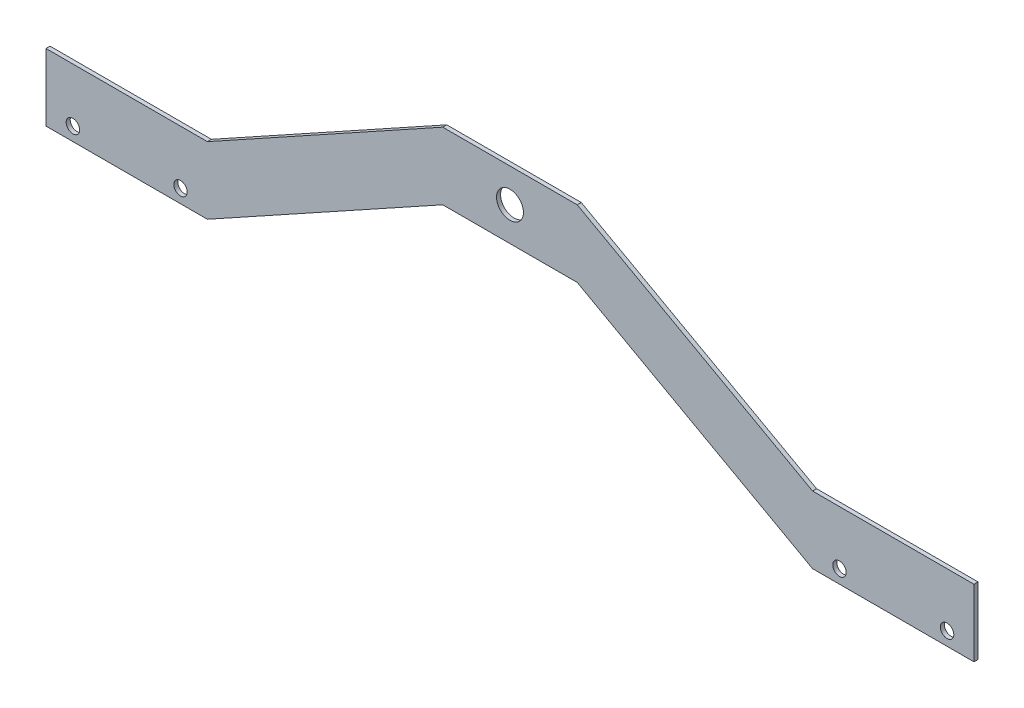
ISO-10303-21;
HEADER;
FILE_DESCRIPTION(('STEP AP214'),'2;1');
FILE_NAME('part.step','',(''),(''),'','','');
FILE_SCHEMA(('AUTOMOTIVE_DESIGN { 1 0 10303 214 1 1 1 1 }'));
ENDSEC;
DATA;
#1=APPLICATION_CONTEXT('core data for automotive mechanical design processes');
#2=APPLICATION_PROTOCOL_DEFINITION('international standard','automotive_design',2000,#1);
#3=PRODUCT_CONTEXT('',#1,'mechanical');
#4=PRODUCT('Part','Part','',(#3));
#5=PRODUCT_RELATED_PRODUCT_CATEGORY('part','',(#4));
#6=PRODUCT_DEFINITION_FORMATION('','',#4);
#7=PRODUCT_DEFINITION_CONTEXT('part definition',#1,'design');
#8=PRODUCT_DEFINITION('design','',#6,#7);
#9=PRODUCT_DEFINITION_SHAPE('','',#8);
#10=(LENGTH_UNIT() NAMED_UNIT(*) SI_UNIT(.MILLI.,.METRE.));
#11=(NAMED_UNIT(*) PLANE_ANGLE_UNIT() SI_UNIT($,.RADIAN.));
#12=(NAMED_UNIT(*) SI_UNIT($,.STERADIAN.) SOLID_ANGLE_UNIT());
#13=UNCERTAINTY_MEASURE_WITH_UNIT(LENGTH_MEASURE(1.E-05),#10,'distance_accuracy_value','');
#14=(GEOMETRIC_REPRESENTATION_CONTEXT(3) GLOBAL_UNCERTAINTY_ASSIGNED_CONTEXT((#13)) GLOBAL_UNIT_ASSIGNED_CONTEXT((#10,
#11,#12)) REPRESENTATION_CONTEXT('',''));
#15=CARTESIAN_POINT('',(0.,0.,0.));
#16=DIRECTION('',(0.,0.,1.));
#17=DIRECTION('',(1.,0.,0.));
#18=AXIS2_PLACEMENT_3D('',#15,#16,#17);
#19=CARTESIAN_POINT('',(0.,0.,3.));
#20=DIRECTION('',(0.,0.,1.));
#21=DIRECTION('',(1.,0.,0.));
#22=AXIS2_PLACEMENT_3D('',#19,#20,#21);
#23=PLANE('',#22);
#24=CARTESIAN_POINT('',(162.368410373495,17.4790107588357,3.));
#25=DIRECTION('',(0.,0.,-1.));
#26=DIRECTION('',(-1.,0.,0.));
#27=AXIS2_PLACEMENT_3D('',#24,#25,#26);
#28=CIRCLE('',#27,5.0000000000001);
#29=CARTESIAN_POINT('',(157.368410373495,17.4790107588357,3.));
#30=VERTEX_POINT('',#29);
#31=EDGE_CURVE('E459',#30,#30,#28,.T.);
#32=ORIENTED_EDGE('',*,*,#31,.T.);
#33=EDGE_LOOP('',(#32));
#34=FACE_BOUND('',#33,.T.);
#35=CARTESIAN_POINT('',(82.3684103734954,17.4790107588357,3.));
#36=DIRECTION('',(0.,0.,-1.));
#37=DIRECTION('',(-1.,0.,0.));
#38=AXIS2_PLACEMENT_3D('',#35,#36,#37);
#39=CIRCLE('',#38,4.99999999999999);
#40=CARTESIAN_POINT('',(77.3684103734954,17.4790107588357,3.));
#41=VERTEX_POINT('',#40);
#42=EDGE_CURVE('E463',#41,#41,#39,.T.);
#43=ORIENTED_EDGE('',*,*,#42,.T.);
#44=EDGE_LOOP('',(#43));
#45=FACE_BOUND('',#44,.T.);
#46=DIRECTION('',(0.,-1.,0.));
#47=VECTOR('',#46,1.);
#48=CARTESIAN_POINT('',(182.368410373495,0.,3.));
#49=LINE('',#48,#47);
#50=CARTESIAN_POINT('',(182.368410373495,57.4790107588357,3.));
#51=VERTEX_POINT('',#50);
#52=CARTESIAN_POINT('',(182.368410373495,7.47901075883569,3.));
#53=VERTEX_POINT('',#52);
#54=EDGE_CURVE('E181',#51,#53,#49,.T.);
#55=ORIENTED_EDGE('',*,*,#54,.F.);
#56=DIRECTION('',(1.,0.,0.));
#57=VECTOR('',#56,1.);
#58=CARTESIAN_POINT('',(0.,57.4790107588357,3.));
#59=LINE('',#58,#57);
#60=CARTESIAN_POINT('',(62.3684103734955,57.4790107588357,3.));
#61=VERTEX_POINT('',#60);
#62=EDGE_CURVE('E217',#61,#51,#59,.T.);
#63=ORIENTED_EDGE('',*,*,#62,.F.);
#64=DIRECTION('',(-0.875,0.484122918275927,0.));
#65=VECTOR('',#64,1.);
#66=CARTESIAN_POINT('',(38.9661393059463,70.4270973456999,3.));
#67=LINE('',#66,#65);
#68=CARTESIAN_POINT('',(-112.631589626505,154.303594414021,3.));
#69=VERTEX_POINT('',#68);
#70=EDGE_CURVE('E206',#61,#69,#67,.T.);
#71=ORIENTED_EDGE('',*,*,#70,.T.);
#72=DIRECTION('',(-1.,0.,0.));
#73=VECTOR('',#72,1.);
#74=CARTESIAN_POINT('',(0.,154.303594414021,3.));
#75=LINE('',#74,#73);
#76=CARTESIAN_POINT('',(-212.631589626505,154.303594414021,3.));
#77=VERTEX_POINT('',#76);
#78=EDGE_CURVE('E226',#69,#77,#75,.T.);
#79=ORIENTED_EDGE('',*,*,#78,.T.);
#80=DIRECTION('',(-0.875,-0.484122918275927,0.));
#81=VECTOR('',#80,1.);
#82=CARTESIAN_POINT('',(-115.19969694337,208.211036949914,3.));
#83=LINE('',#82,#81);
#84=CARTESIAN_POINT('',(-387.631589626504,57.4790107588356,3.));
#85=VERTEX_POINT('',#84);
#86=EDGE_CURVE('E228',#77,#85,#83,.T.);
#87=ORIENTED_EDGE('',*,*,#86,.T.);
#88=DIRECTION('',(-1.,0.,0.));
#89=VECTOR('',#88,1.);
#90=CARTESIAN_POINT('',(0.,57.4790107588357,3.));
#91=LINE('',#90,#89);
#92=CARTESIAN_POINT('',(-507.631589626504,57.4790107588356,3.));
#93=VERTEX_POINT('',#92);
#94=EDGE_CURVE('E230',#85,#93,#91,.T.);
#95=ORIENTED_EDGE('',*,*,#94,.T.);
#96=DIRECTION('',(0.,-1.,0.));
#97=VECTOR('',#96,1.);
#98=CARTESIAN_POINT('',(-507.631589626504,0.,3.));
#99=LINE('',#98,#97);
#100=CARTESIAN_POINT('',(-507.631589626504,7.47901075883575,3.));
#101=VERTEX_POINT('',#100);
#102=EDGE_CURVE('E232',#93,#101,#99,.T.);
#103=ORIENTED_EDGE('',*,*,#102,.T.);
#104=DIRECTION('',(1.,0.,0.));
#105=VECTOR('',#104,1.);
#106=CARTESIAN_POINT('',(0.,7.47901075883545,3.));
#107=LINE('',#106,#105);
#108=CARTESIAN_POINT('',(-387.631589626504,7.47901075883572,3.));
#109=VERTEX_POINT('',#108);
#110=EDGE_CURVE('E234',#101,#109,#107,.T.);
#111=ORIENTED_EDGE('',*,*,#110,.T.);
#112=DIRECTION('',(-0.875,-0.484122918275927,0.));
#113=VECTOR('',#112,1.);
#114=CARTESIAN_POINT('',(-94.0193192687986,169.929786949914,3.));
#115=LINE('',#114,#113);
#116=CARTESIAN_POINT('',(-212.631589626505,104.303594414021,3.));
#117=VERTEX_POINT('',#116);
#118=EDGE_CURVE('E146',#117,#109,#115,.T.);
#119=ORIENTED_EDGE('',*,*,#118,.F.);
#120=DIRECTION('',(-1.,0.,0.));
#121=VECTOR('',#120,1.);
#122=CARTESIAN_POINT('',(0.,104.303594414021,3.));
#123=LINE('',#122,#121);
#124=CARTESIAN_POINT('',(-112.631589626505,104.303594414021,3.));
#125=VERTEX_POINT('',#124);
#126=EDGE_CURVE('E133',#125,#117,#123,.T.);
#127=ORIENTED_EDGE('',*,*,#126,.F.);
#128=DIRECTION('',(-0.875,0.484122918275927,0.));
#129=VECTOR('',#128,1.);
#130=CARTESIAN_POINT('',(17.7857616313745,32.1458473456999,3.));
#131=LINE('',#130,#129);
#132=CARTESIAN_POINT('',(62.3684103734955,7.47901075883569,3.));
#133=VERTEX_POINT('',#132);
#134=EDGE_CURVE('E144',#133,#125,#131,.T.);
#135=ORIENTED_EDGE('',*,*,#134,.F.);
#136=DIRECTION('',(1.,0.,0.));
#137=VECTOR('',#136,1.);
#138=CARTESIAN_POINT('',(0.,7.47901075883569,3.));
#139=LINE('',#138,#137);
#140=EDGE_CURVE('E53',#133,#53,#139,.T.);
#141=ORIENTED_EDGE('',*,*,#140,.T.);
#142=EDGE_LOOP('',(#55,#63,#71,#79,#87,#95,#103,#111,#119,#127,#135,#141));
#143=FACE_BOUND('',#142,.T.);
#144=CARTESIAN_POINT('',(-487.631589626504,17.4790107588357,3.));
#145=DIRECTION('',(0.,0.,1.));
#146=DIRECTION('',(1.,0.,0.));
#147=AXIS2_PLACEMENT_3D('',#144,#145,#146);
#148=CIRCLE('',#147,4.99999999999999);
#149=CARTESIAN_POINT('',(-482.631589626504,17.4790107588357,3.));
#150=VERTEX_POINT('',#149);
#151=EDGE_CURVE('E453',#150,#150,#148,.T.);
#152=ORIENTED_EDGE('',*,*,#151,.F.);
#153=EDGE_LOOP('',(#152));
#154=FACE_BOUND('',#153,.T.);
#155=CARTESIAN_POINT('',(-407.631589626504,17.4790107588357,3.));
#156=DIRECTION('',(0.,0.,1.));
#157=DIRECTION('',(1.,0.,0.));
#158=AXIS2_PLACEMENT_3D('',#155,#156,#157);
#159=CIRCLE('',#158,4.99999999999999);
#160=CARTESIAN_POINT('',(-402.631589626504,17.4790107588357,3.));
#161=VERTEX_POINT('',#160);
#162=EDGE_CURVE('E444',#161,#161,#159,.T.);
#163=ORIENTED_EDGE('',*,*,#162,.F.);
#164=EDGE_LOOP('',(#163));
#165=FACE_BOUND('',#164,.T.);
#166=CARTESIAN_POINT('',(-162.631589626504,129.303594414021,3.));
#167=DIRECTION('',(0.,0.,1.));
#168=DIRECTION('',(1.,0.,0.));
#169=AXIS2_PLACEMENT_3D('',#166,#167,#168);
#170=CIRCLE('',#169,10.);
#171=CARTESIAN_POINT('',(-152.631589626504,129.303594414021,3.));
#172=VERTEX_POINT('',#171);
#173=EDGE_CURVE('E442',#172,#172,#170,.T.);
#174=ORIENTED_EDGE('',*,*,#173,.F.);
#175=EDGE_LOOP('',(#174));
#176=FACE_BOUND('',#175,.T.);
#177=ADVANCED_FACE('F36',(#34,#45,#143,#154,#165,#176),#23,.T.);
#178=CARTESIAN_POINT('',(0.,0.,0.));
#179=DIRECTION('',(0.,0.,1.));
#180=DIRECTION('',(1.,0.,0.));
#181=AXIS2_PLACEMENT_3D('',#178,#179,#180);
#182=PLANE('',#181);
#183=CARTESIAN_POINT('',(-407.631589626504,17.4790107588357,0.));
#184=DIRECTION('',(0.,0.,1.));
#185=DIRECTION('',(1.,0.,0.));
#186=AXIS2_PLACEMENT_3D('',#183,#184,#185);
#187=CIRCLE('',#186,4.99999999999999);
#188=CARTESIAN_POINT('',(-402.631589626504,17.4790107588357,0.));
#189=VERTEX_POINT('',#188);
#190=EDGE_CURVE('E448',#189,#189,#187,.T.);
#191=ORIENTED_EDGE('',*,*,#190,.T.);
#192=EDGE_LOOP('',(#191));
#193=FACE_BOUND('',#192,.T.);
#194=DIRECTION('',(0.,-1.,0.));
#195=VECTOR('',#194,1.);
#196=CARTESIAN_POINT('',(182.368410373495,0.,0.));
#197=LINE('',#196,#195);
#198=CARTESIAN_POINT('',(182.368410373495,57.4790107588357,0.));
#199=VERTEX_POINT('',#198);
#200=CARTESIAN_POINT('',(182.368410373495,7.47901075883569,0.));
#201=VERTEX_POINT('',#200);
#202=EDGE_CURVE('E153',#199,#201,#197,.T.);
#203=ORIENTED_EDGE('',*,*,#202,.T.);
#204=DIRECTION('',(1.,0.,0.));
#205=VECTOR('',#204,1.);
#206=CARTESIAN_POINT('',(0.,7.47901075883569,0.));
#207=LINE('',#206,#205);
#208=CARTESIAN_POINT('',(62.3684103734955,7.47901075883569,0.));
#209=VERTEX_POINT('',#208);
#210=EDGE_CURVE('E179',#209,#201,#207,.T.);
#211=ORIENTED_EDGE('',*,*,#210,.F.);
#212=DIRECTION('',(-0.875,0.484122918275927,0.));
#213=VECTOR('',#212,1.);
#214=CARTESIAN_POINT('',(17.7857616313745,32.1458473456999,0.));
#215=LINE('',#214,#213);
#216=CARTESIAN_POINT('',(-112.631589626505,104.303594414021,0.));
#217=VERTEX_POINT('',#216);
#218=EDGE_CURVE('E177',#209,#217,#215,.T.);
#219=ORIENTED_EDGE('',*,*,#218,.T.);
#220=DIRECTION('',(-1.,0.,0.));
#221=VECTOR('',#220,1.);
#222=CARTESIAN_POINT('',(0.,104.303594414021,0.));
#223=LINE('',#222,#221);
#224=CARTESIAN_POINT('',(-212.631589626505,104.303594414021,0.));
#225=VERTEX_POINT('',#224);
#226=EDGE_CURVE('E135',#217,#225,#223,.T.);
#227=ORIENTED_EDGE('',*,*,#226,.T.);
#228=DIRECTION('',(-0.875,-0.484122918275927,0.));
#229=VECTOR('',#228,1.);
#230=CARTESIAN_POINT('',(-94.0193192687986,169.929786949914,0.));
#231=LINE('',#230,#229);
#232=CARTESIAN_POINT('',(-387.631589626504,7.47901075883572,0.));
#233=VERTEX_POINT('',#232);
#234=EDGE_CURVE('E173',#225,#233,#231,.T.);
#235=ORIENTED_EDGE('',*,*,#234,.T.);
#236=DIRECTION('',(1.,0.,0.));
#237=VECTOR('',#236,1.);
#238=CARTESIAN_POINT('',(0.,7.47901075883545,0.));
#239=LINE('',#238,#237);
#240=CARTESIAN_POINT('',(-507.631589626504,7.47901075883575,0.));
#241=VERTEX_POINT('',#240);
#242=EDGE_CURVE('E170',#241,#233,#239,.T.);
#243=ORIENTED_EDGE('',*,*,#242,.F.);
#244=DIRECTION('',(0.,-1.,0.));
#245=VECTOR('',#244,1.);
#246=CARTESIAN_POINT('',(-507.631589626504,0.,0.));
#247=LINE('',#246,#245);
#248=CARTESIAN_POINT('',(-507.631589626504,57.4790107588356,0.));
#249=VERTEX_POINT('',#248);
#250=EDGE_CURVE('E168',#249,#241,#247,.T.);
#251=ORIENTED_EDGE('',*,*,#250,.F.);
#252=DIRECTION('',(-1.,0.,0.));
#253=VECTOR('',#252,1.);
#254=CARTESIAN_POINT('',(0.,57.4790107588357,0.));
#255=LINE('',#254,#253);
#256=CARTESIAN_POINT('',(-387.631589626504,57.4790107588356,0.));
#257=VERTEX_POINT('',#256);
#258=EDGE_CURVE('E166',#257,#249,#255,.T.);
#259=ORIENTED_EDGE('',*,*,#258,.F.);
#260=DIRECTION('',(-0.875,-0.484122918275927,0.));
#261=VECTOR('',#260,1.);
#262=CARTESIAN_POINT('',(-115.19969694337,208.211036949914,0.));
#263=LINE('',#262,#261);
#264=CARTESIAN_POINT('',(-212.631589626505,154.303594414021,0.));
#265=VERTEX_POINT('',#264);
#266=EDGE_CURVE('E164',#265,#257,#263,.T.);
#267=ORIENTED_EDGE('',*,*,#266,.F.);
#268=DIRECTION('',(-1.,0.,0.));
#269=VECTOR('',#268,1.);
#270=CARTESIAN_POINT('',(0.,154.303594414021,0.));
#271=LINE('',#270,#269);
#272=CARTESIAN_POINT('',(-112.631589626505,154.303594414021,0.));
#273=VERTEX_POINT('',#272);
#274=EDGE_CURVE('E162',#273,#265,#271,.T.);
#275=ORIENTED_EDGE('',*,*,#274,.F.);
#276=DIRECTION('',(-0.875,0.484122918275927,0.));
#277=VECTOR('',#276,1.);
#278=CARTESIAN_POINT('',(38.9661393059463,70.4270973456999,0.));
#279=LINE('',#278,#277);
#280=CARTESIAN_POINT('',(62.3684103734955,57.4790107588357,0.));
#281=VERTEX_POINT('',#280);
#282=EDGE_CURVE('E160',#281,#273,#279,.T.);
#283=ORIENTED_EDGE('',*,*,#282,.F.);
#284=DIRECTION('',(1.,0.,0.));
#285=VECTOR('',#284,1.);
#286=CARTESIAN_POINT('',(0.,57.4790107588357,0.));
#287=LINE('',#286,#285);
#288=EDGE_CURVE('E156',#281,#199,#287,.T.);
#289=ORIENTED_EDGE('',*,*,#288,.T.);
#290=EDGE_LOOP('',(#203,#211,#219,#227,#235,#243,#251,#259,#267,#275,#283,#289));
#291=FACE_BOUND('',#290,.T.);
#292=CARTESIAN_POINT('',(82.3684103734954,17.4790107588357,0.));
#293=DIRECTION('',(0.,0.,-1.));
#294=DIRECTION('',(-1.,0.,0.));
#295=AXIS2_PLACEMENT_3D('',#292,#293,#294);
#296=CIRCLE('',#295,4.99999999999999);
#297=CARTESIAN_POINT('',(77.3684103734954,17.4790107588357,0.));
#298=VERTEX_POINT('',#297);
#299=EDGE_CURVE('E222',#298,#298,#296,.T.);
#300=ORIENTED_EDGE('',*,*,#299,.F.);
#301=EDGE_LOOP('',(#300));
#302=FACE_BOUND('',#301,.T.);
#303=CARTESIAN_POINT('',(162.368410373495,17.4790107588357,0.));
#304=DIRECTION('',(0.,0.,-1.));
#305=DIRECTION('',(-1.,0.,0.));
#306=AXIS2_PLACEMENT_3D('',#303,#304,#305);
#307=CIRCLE('',#306,5.0000000000001);
#308=CARTESIAN_POINT('',(157.368410373495,17.4790107588357,0.));
#309=VERTEX_POINT('',#308);
#310=EDGE_CURVE('E461',#309,#309,#307,.T.);
#311=ORIENTED_EDGE('',*,*,#310,.F.);
#312=EDGE_LOOP('',(#311));
#313=FACE_BOUND('',#312,.T.);
#314=CARTESIAN_POINT('',(-487.631589626504,17.4790107588357,0.));
#315=DIRECTION('',(0.,0.,1.));
#316=DIRECTION('',(1.,0.,0.));
#317=AXIS2_PLACEMENT_3D('',#314,#315,#316);
#318=CIRCLE('',#317,4.99999999999999);
#319=CARTESIAN_POINT('',(-482.631589626504,17.4790107588357,0.));
#320=VERTEX_POINT('',#319);
#321=EDGE_CURVE('E456',#320,#320,#318,.T.);
#322=ORIENTED_EDGE('',*,*,#321,.T.);
#323=EDGE_LOOP('',(#322));
#324=FACE_BOUND('',#323,.T.);
#325=CARTESIAN_POINT('',(-162.631589626504,129.303594414021,0.));
#326=DIRECTION('',(0.,0.,1.));
#327=DIRECTION('',(1.,0.,0.));
#328=AXIS2_PLACEMENT_3D('',#325,#326,#327);
#329=CIRCLE('',#328,10.);
#330=CARTESIAN_POINT('',(-152.631589626504,129.303594414021,0.));
#331=VERTEX_POINT('',#330);
#332=EDGE_CURVE('E157',#331,#331,#329,.T.);
#333=ORIENTED_EDGE('',*,*,#332,.T.);
#334=EDGE_LOOP('',(#333));
#335=FACE_BOUND('',#334,.T.);
#336=ADVANCED_FACE('F213',(#193,#291,#302,#313,#324,#335),#182,.F.);
#337=CARTESIAN_POINT('',(182.368410373495,0.,3.));
#338=DIRECTION('',(1.,0.,0.));
#339=DIRECTION('',(0.,0.,-1.));
#340=AXIS2_PLACEMENT_3D('',#337,#338,#339);
#341=PLANE('',#340);
#342=ORIENTED_EDGE('',*,*,#202,.F.);
#343=DIRECTION('',(0.,0.,-1.));
#344=VECTOR('',#343,1.);
#345=CARTESIAN_POINT('',(182.368410373495,57.4790107588357,3.));
#346=LINE('',#345,#344);
#347=EDGE_CURVE('E11',#51,#199,#346,.T.);
#348=ORIENTED_EDGE('',*,*,#347,.F.);
#349=ORIENTED_EDGE('',*,*,#54,.T.);
#350=DIRECTION('',(0.,0.,-1.));
#351=VECTOR('',#350,1.);
#352=CARTESIAN_POINT('',(182.368410373495,7.47901075883569,3.));
#353=LINE('',#352,#351);
#354=EDGE_CURVE('E99',#53,#201,#353,.T.);
#355=ORIENTED_EDGE('',*,*,#354,.T.);
#356=EDGE_LOOP('',(#342,#348,#349,#355));
#357=FACE_BOUND('',#356,.T.);
#358=ADVANCED_FACE('F38',(#357),#341,.T.);
#359=CARTESIAN_POINT('',(0.,57.4790107588357,3.));
#360=DIRECTION('',(0.,1.,0.));
#361=DIRECTION('',(-1.,0.,0.));
#362=AXIS2_PLACEMENT_3D('',#359,#360,#361);
#363=PLANE('',#362);
#364=ORIENTED_EDGE('',*,*,#288,.F.);
#365=DIRECTION('',(0.,0.,-1.));
#366=VECTOR('',#365,1.);
#367=CARTESIAN_POINT('',(62.3684103734955,57.4790107588357,3.));
#368=LINE('',#367,#366);
#369=EDGE_CURVE('E45',#61,#281,#368,.T.);
#370=ORIENTED_EDGE('',*,*,#369,.F.);
#371=ORIENTED_EDGE('',*,*,#62,.T.);
#372=ORIENTED_EDGE('',*,*,#347,.T.);
#373=EDGE_LOOP('',(#364,#370,#371,#372));
#374=FACE_BOUND('',#373,.T.);
#375=ADVANCED_FACE('F216',(#374),#363,.T.);
#376=CARTESIAN_POINT('',(38.9661393059463,70.4270973456999,3.));
#377=DIRECTION('',(-0.484122918275927,-0.875,0.));
#378=DIRECTION('',(0.875,-0.484122918275927,0.));
#379=AXIS2_PLACEMENT_3D('',#376,#377,#378);
#380=PLANE('',#379);
#381=ORIENTED_EDGE('',*,*,#282,.T.);
#382=DIRECTION('',(0.,0.,-1.));
#383=VECTOR('',#382,1.);
#384=CARTESIAN_POINT('',(-112.631589626505,154.303594414021,3.));
#385=LINE('',#384,#383);
#386=EDGE_CURVE('E199',#69,#273,#385,.T.);
#387=ORIENTED_EDGE('',*,*,#386,.F.);
#388=ORIENTED_EDGE('',*,*,#70,.F.);
#389=ORIENTED_EDGE('',*,*,#369,.T.);
#390=EDGE_LOOP('',(#381,#387,#388,#389));
#391=FACE_BOUND('',#390,.T.);
#392=ADVANCED_FACE('F204',(#391),#380,.F.);
#393=CARTESIAN_POINT('',(0.,154.303594414021,3.));
#394=DIRECTION('',(0.,-1.,0.));
#395=DIRECTION('',(0.,0.,-1.));
#396=AXIS2_PLACEMENT_3D('',#393,#394,#395);
#397=PLANE('',#396);
#398=ORIENTED_EDGE('',*,*,#274,.T.);
#399=DIRECTION('',(0.,0.,-1.));
#400=VECTOR('',#399,1.);
#401=CARTESIAN_POINT('',(-212.631589626505,154.303594414021,3.));
#402=LINE('',#401,#400);
#403=EDGE_CURVE('E196',#77,#265,#402,.T.);
#404=ORIENTED_EDGE('',*,*,#403,.F.);
#405=ORIENTED_EDGE('',*,*,#78,.F.);
#406=ORIENTED_EDGE('',*,*,#386,.T.);
#407=EDGE_LOOP('',(#398,#404,#405,#406));
#408=FACE_BOUND('',#407,.T.);
#409=ADVANCED_FACE('F260',(#408),#397,.F.);
#410=CARTESIAN_POINT('',(-115.19969694337,208.211036949914,3.));
#411=DIRECTION('',(0.484122918275927,-0.875,0.));
#412=DIRECTION('',(0.875,0.484122918275927,0.));
#413=AXIS2_PLACEMENT_3D('',#410,#411,#412);
#414=PLANE('',#413);
#415=ORIENTED_EDGE('',*,*,#266,.T.);
#416=DIRECTION('',(0.,0.,-1.));
#417=VECTOR('',#416,1.);
#418=CARTESIAN_POINT('',(-387.631589626504,57.4790107588356,3.));
#419=LINE('',#418,#417);
#420=EDGE_CURVE('E193',#85,#257,#419,.T.);
#421=ORIENTED_EDGE('',*,*,#420,.F.);
#422=ORIENTED_EDGE('',*,*,#86,.F.);
#423=ORIENTED_EDGE('',*,*,#403,.T.);
#424=EDGE_LOOP('',(#415,#421,#422,#423));
#425=FACE_BOUND('',#424,.T.);
#426=ADVANCED_FACE('F255',(#425),#414,.F.);
#427=CARTESIAN_POINT('',(0.,57.4790107588357,3.));
#428=DIRECTION('',(0.,-1.,0.));
#429=DIRECTION('',(1.,0.,0.));
#430=AXIS2_PLACEMENT_3D('',#427,#428,#429);
#431=PLANE('',#430);
#432=ORIENTED_EDGE('',*,*,#258,.T.);
#433=DIRECTION('',(0.,0.,-1.));
#434=VECTOR('',#433,1.);
#435=CARTESIAN_POINT('',(-507.631589626504,57.4790107588356,3.));
#436=LINE('',#435,#434);
#437=EDGE_CURVE('E190',#93,#249,#436,.T.);
#438=ORIENTED_EDGE('',*,*,#437,.F.);
#439=ORIENTED_EDGE('',*,*,#94,.F.);
#440=ORIENTED_EDGE('',*,*,#420,.T.);
#441=EDGE_LOOP('',(#432,#438,#439,#440));
#442=FACE_BOUND('',#441,.T.);
#443=ADVANCED_FACE('F252',(#442),#431,.F.);
#444=CARTESIAN_POINT('',(-507.631589626504,0.,3.));
#445=DIRECTION('',(1.,0.,0.));
#446=DIRECTION('',(0.,0.,-1.));
#447=AXIS2_PLACEMENT_3D('',#444,#445,#446);
#448=PLANE('',#447);
#449=ORIENTED_EDGE('',*,*,#250,.T.);
#450=DIRECTION('',(0.,0.,-1.));
#451=VECTOR('',#450,1.);
#452=CARTESIAN_POINT('',(-507.631589626504,7.47901075883575,3.));
#453=LINE('',#452,#451);
#454=EDGE_CURVE('E187',#101,#241,#453,.T.);
#455=ORIENTED_EDGE('',*,*,#454,.F.);
#456=ORIENTED_EDGE('',*,*,#102,.F.);
#457=ORIENTED_EDGE('',*,*,#437,.T.);
#458=EDGE_LOOP('',(#449,#455,#456,#457));
#459=FACE_BOUND('',#458,.T.);
#460=ADVANCED_FACE('F248',(#459),#448,.F.);
#461=CARTESIAN_POINT('',(0.,7.47901075883545,3.));
#462=DIRECTION('',(0.,1.,0.));
#463=DIRECTION('',(-1.,0.,0.));
#464=AXIS2_PLACEMENT_3D('',#461,#462,#463);
#465=PLANE('',#464);
#466=ORIENTED_EDGE('',*,*,#242,.T.);
#467=DIRECTION('',(0.,0.,-1.));
#468=VECTOR('',#467,1.);
#469=CARTESIAN_POINT('',(-387.631589626504,7.47901075883572,3.));
#470=LINE('',#469,#468);
#471=EDGE_CURVE('E185',#109,#233,#470,.T.);
#472=ORIENTED_EDGE('',*,*,#471,.F.);
#473=ORIENTED_EDGE('',*,*,#110,.F.);
#474=ORIENTED_EDGE('',*,*,#454,.T.);
#475=EDGE_LOOP('',(#466,#472,#473,#474));
#476=FACE_BOUND('',#475,.T.);
#477=ADVANCED_FACE('F243',(#476),#465,.F.);
#478=CARTESIAN_POINT('',(-94.0193192687986,169.929786949914,3.));
#479=DIRECTION('',(0.484122918275927,-0.875,0.));
#480=DIRECTION('',(0.875,0.484122918275927,0.));
#481=AXIS2_PLACEMENT_3D('',#478,#479,#480);
#482=PLANE('',#481);
#483=ORIENTED_EDGE('',*,*,#234,.F.);
#484=DIRECTION('',(0.,0.,-1.));
#485=VECTOR('',#484,1.);
#486=CARTESIAN_POINT('',(-212.631589626505,104.303594414021,3.));
#487=LINE('',#486,#485);
#488=EDGE_CURVE('E140',#117,#225,#487,.T.);
#489=ORIENTED_EDGE('',*,*,#488,.F.);
#490=ORIENTED_EDGE('',*,*,#118,.T.);
#491=ORIENTED_EDGE('',*,*,#471,.T.);
#492=EDGE_LOOP('',(#483,#489,#490,#491));
#493=FACE_BOUND('',#492,.T.);
#494=ADVANCED_FACE('F237',(#493),#482,.T.);
#495=CARTESIAN_POINT('',(0.,104.303594414021,3.));
#496=DIRECTION('',(0.,-1.,0.));
#497=DIRECTION('',(1.,0.,0.));
#498=AXIS2_PLACEMENT_3D('',#495,#496,#497);
#499=PLANE('',#498);
#500=ORIENTED_EDGE('',*,*,#226,.F.);
#501=DIRECTION('',(0.,0.,-1.));
#502=VECTOR('',#501,1.);
#503=CARTESIAN_POINT('',(-112.631589626505,104.303594414021,3.));
#504=LINE('',#503,#502);
#505=EDGE_CURVE('E130',#125,#217,#504,.T.);
#506=ORIENTED_EDGE('',*,*,#505,.F.);
#507=ORIENTED_EDGE('',*,*,#126,.T.);
#508=ORIENTED_EDGE('',*,*,#488,.T.);
#509=EDGE_LOOP('',(#500,#506,#507,#508));
#510=FACE_BOUND('',#509,.T.);
#511=ADVANCED_FACE('F132',(#510),#499,.T.);
#512=CARTESIAN_POINT('',(17.7857616313745,32.1458473456999,3.));
#513=DIRECTION('',(-0.484122918275927,-0.875,0.));
#514=DIRECTION('',(0.875,-0.484122918275927,0.));
#515=AXIS2_PLACEMENT_3D('',#512,#513,#514);
#516=PLANE('',#515);
#517=ORIENTED_EDGE('',*,*,#218,.F.);
#518=DIRECTION('',(0.,0.,-1.));
#519=VECTOR('',#518,1.);
#520=CARTESIAN_POINT('',(62.3684103734955,7.47901075883569,3.));
#521=LINE('',#520,#519);
#522=EDGE_CURVE('E92',#133,#209,#521,.T.);
#523=ORIENTED_EDGE('',*,*,#522,.F.);
#524=ORIENTED_EDGE('',*,*,#134,.T.);
#525=ORIENTED_EDGE('',*,*,#505,.T.);
#526=EDGE_LOOP('',(#517,#523,#524,#525));
#527=FACE_BOUND('',#526,.T.);
#528=ADVANCED_FACE('F148',(#527),#516,.T.);
#529=CARTESIAN_POINT('',(0.,7.47901075883569,3.));
#530=DIRECTION('',(0.,1.,0.));
#531=DIRECTION('',(-1.,0.,0.));
#532=AXIS2_PLACEMENT_3D('',#529,#530,#531);
#533=PLANE('',#532);
#534=ORIENTED_EDGE('',*,*,#210,.T.);
#535=ORIENTED_EDGE('',*,*,#354,.F.);
#536=ORIENTED_EDGE('',*,*,#140,.F.);
#537=ORIENTED_EDGE('',*,*,#522,.T.);
#538=EDGE_LOOP('',(#534,#535,#536,#537));
#539=FACE_BOUND('',#538,.T.);
#540=ADVANCED_FACE('F218',(#539),#533,.F.);
#541=CARTESIAN_POINT('',(82.3684103734954,17.4790107588357,0.));
#542=DIRECTION('',(0.,0.,1.));
#543=DIRECTION('',(1.,0.,0.));
#544=AXIS2_PLACEMENT_3D('',#541,#542,#543);
#545=CYLINDRICAL_SURFACE('',#544,4.99999999999999);
#546=ORIENTED_EDGE('',*,*,#299,.T.);
#547=EDGE_LOOP('',(#546));
#548=FACE_BOUND('',#547,.T.);
#549=ORIENTED_EDGE('',*,*,#42,.F.);
#550=EDGE_LOOP('',(#549));
#551=FACE_BOUND('',#550,.T.);
#552=ADVANCED_FACE('F280',(#548,#551),#545,.F.);
#553=CARTESIAN_POINT('',(162.368410373495,17.4790107588357,0.));
#554=DIRECTION('',(0.,0.,1.));
#555=DIRECTION('',(1.,0.,0.));
#556=AXIS2_PLACEMENT_3D('',#553,#554,#555);
#557=CYLINDRICAL_SURFACE('',#556,5.0000000000001);
#558=ORIENTED_EDGE('',*,*,#310,.T.);
#559=EDGE_LOOP('',(#558));
#560=FACE_BOUND('',#559,.T.);
#561=ORIENTED_EDGE('',*,*,#31,.F.);
#562=EDGE_LOOP('',(#561));
#563=FACE_BOUND('',#562,.T.);
#564=ADVANCED_FACE('F330',(#560,#563),#557,.F.);
#565=CARTESIAN_POINT('',(-487.631589626504,17.4790107588357,0.));
#566=DIRECTION('',(0.,0.,1.));
#567=DIRECTION('',(1.,0.,0.));
#568=AXIS2_PLACEMENT_3D('',#565,#566,#567);
#569=CYLINDRICAL_SURFACE('',#568,4.99999999999999);
#570=ORIENTED_EDGE('',*,*,#321,.F.);
#571=EDGE_LOOP('',(#570));
#572=FACE_BOUND('',#571,.T.);
#573=ORIENTED_EDGE('',*,*,#151,.T.);
#574=EDGE_LOOP('',(#573));
#575=FACE_BOUND('',#574,.T.);
#576=ADVANCED_FACE('F338',(#572,#575),#569,.F.);
#577=CARTESIAN_POINT('',(-407.631589626504,17.4790107588357,0.));
#578=DIRECTION('',(0.,0.,1.));
#579=DIRECTION('',(1.,0.,0.));
#580=AXIS2_PLACEMENT_3D('',#577,#578,#579);
#581=CYLINDRICAL_SURFACE('',#580,4.99999999999999);
#582=ORIENTED_EDGE('',*,*,#190,.F.);
#583=EDGE_LOOP('',(#582));
#584=FACE_BOUND('',#583,.T.);
#585=ORIENTED_EDGE('',*,*,#162,.T.);
#586=EDGE_LOOP('',(#585));
#587=FACE_BOUND('',#586,.T.);
#588=ADVANCED_FACE('F345',(#584,#587),#581,.F.);
#589=CARTESIAN_POINT('',(-162.631589626504,129.303594414021,0.));
#590=DIRECTION('',(0.,0.,1.));
#591=DIRECTION('',(1.,0.,0.));
#592=AXIS2_PLACEMENT_3D('',#589,#590,#591);
#593=CYLINDRICAL_SURFACE('',#592,10.);
#594=ORIENTED_EDGE('',*,*,#332,.F.);
#595=EDGE_LOOP('',(#594));
#596=FACE_BOUND('',#595,.T.);
#597=ORIENTED_EDGE('',*,*,#173,.T.);
#598=EDGE_LOOP('',(#597));
#599=FACE_BOUND('',#598,.T.);
#600=ADVANCED_FACE('F353',(#596,#599),#593,.F.);
#601=CLOSED_SHELL('',(#177,#336,#358,#375,#392,#409,#426,#443,#460,#477,#494,#511,#528,#540,
#552,#564,#576,#588,#600));
#602=MANIFOLD_SOLID_BREP('B2',#601);
#603=ADVANCED_BREP_SHAPE_REPRESENTATION('',(#18,#602),#14);
#604=SHAPE_DEFINITION_REPRESENTATION(#9,#603);
ENDSEC;
END-ISO-10303-21;
